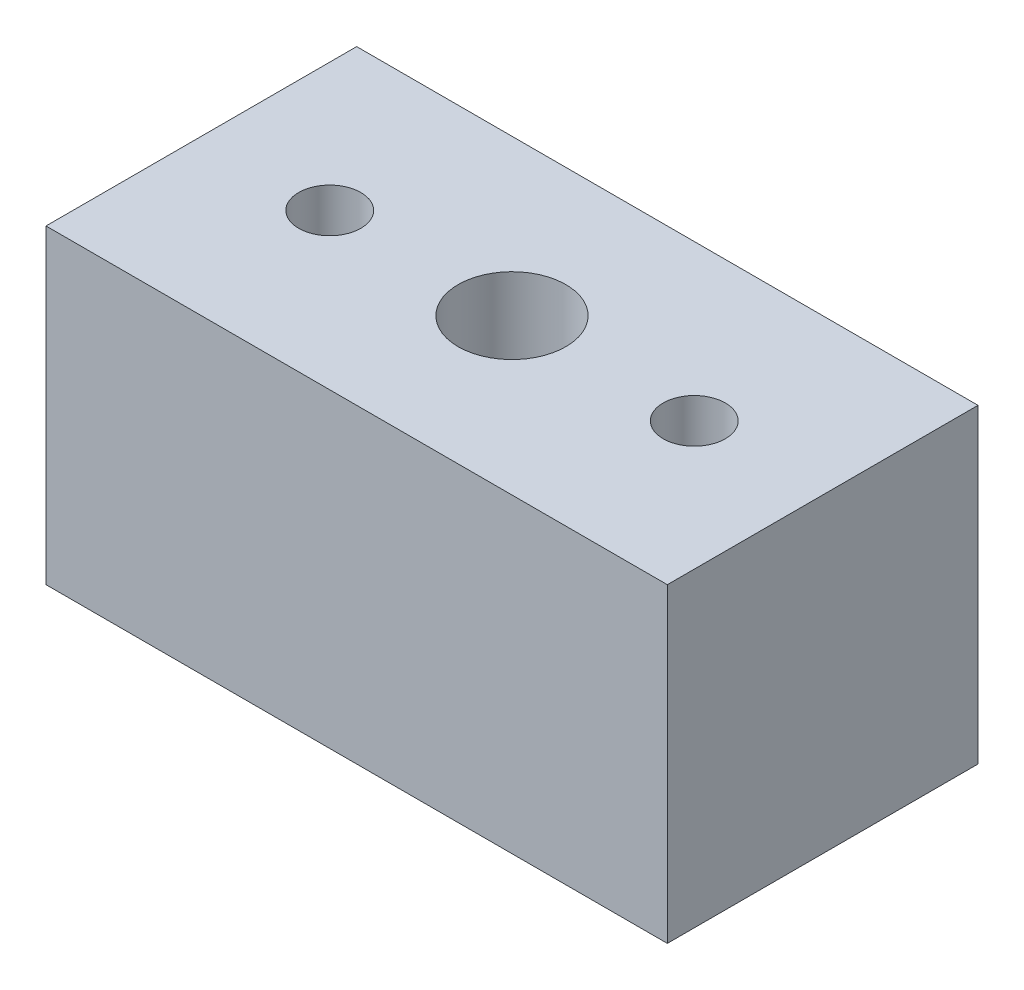
ISO-10303-21;
HEADER;
FILE_DESCRIPTION(('STEP AP214'),'2;1');
FILE_NAME('part.step','',(''),(''),'','','');
FILE_SCHEMA(('AUTOMOTIVE_DESIGN { 1 0 10303 214 1 1 1 1 }'));
ENDSEC;
DATA;
#1=APPLICATION_CONTEXT('core data for automotive mechanical design processes');
#2=APPLICATION_PROTOCOL_DEFINITION('international standard','automotive_design',2000,#1);
#3=PRODUCT_CONTEXT('',#1,'mechanical');
#4=PRODUCT('Part','Part','',(#3));
#5=PRODUCT_RELATED_PRODUCT_CATEGORY('part','',(#4));
#6=PRODUCT_DEFINITION_FORMATION('','',#4);
#7=PRODUCT_DEFINITION_CONTEXT('part definition',#1,'design');
#8=PRODUCT_DEFINITION('design','',#6,#7);
#9=PRODUCT_DEFINITION_SHAPE('','',#8);
#10=(LENGTH_UNIT() NAMED_UNIT(*) SI_UNIT(.MILLI.,.METRE.));
#11=(NAMED_UNIT(*) PLANE_ANGLE_UNIT() SI_UNIT($,.RADIAN.));
#12=(NAMED_UNIT(*) SI_UNIT($,.STERADIAN.) SOLID_ANGLE_UNIT());
#13=UNCERTAINTY_MEASURE_WITH_UNIT(LENGTH_MEASURE(1.E-05),#10,'distance_accuracy_value','');
#14=(GEOMETRIC_REPRESENTATION_CONTEXT(3) GLOBAL_UNCERTAINTY_ASSIGNED_CONTEXT((#13)) GLOBAL_UNIT_ASSIGNED_CONTEXT((#10,
#11,#12)) REPRESENTATION_CONTEXT('',''));
#15=CARTESIAN_POINT('',(0.,0.,0.));
#16=DIRECTION('',(0.,0.,1.));
#17=DIRECTION('',(1.,0.,0.));
#18=AXIS2_PLACEMENT_3D('',#15,#16,#17);
#19=CARTESIAN_POINT('',(15.,15.,7.5));
#20=DIRECTION('',(-1.,0.,0.));
#21=DIRECTION('',(0.,0.,1.));
#22=AXIS2_PLACEMENT_3D('',#19,#20,#21);
#23=PLANE('',#22);
#24=DIRECTION('',(0.,0.,-1.));
#25=VECTOR('',#24,1.);
#26=CARTESIAN_POINT('',(15.,0.,7.5));
#27=LINE('',#26,#25);
#28=CARTESIAN_POINT('',(15.,0.,7.5));
#29=VERTEX_POINT('',#28);
#30=CARTESIAN_POINT('',(15.,0.,-7.5));
#31=VERTEX_POINT('',#30);
#32=EDGE_CURVE('E97',#29,#31,#27,.T.);
#33=ORIENTED_EDGE('',*,*,#32,.T.);
#34=DIRECTION('',(0.,-1.,0.));
#35=VECTOR('',#34,1.);
#36=CARTESIAN_POINT('',(15.,15.,-7.5));
#37=LINE('',#36,#35);
#38=CARTESIAN_POINT('',(15.,15.,-7.5));
#39=VERTEX_POINT('',#38);
#40=EDGE_CURVE('E11',#39,#31,#37,.T.);
#41=ORIENTED_EDGE('',*,*,#40,.F.);
#42=DIRECTION('',(0.,0.,-1.));
#43=VECTOR('',#42,1.);
#44=CARTESIAN_POINT('',(15.,15.,7.5));
#45=LINE('',#44,#43);
#46=CARTESIAN_POINT('',(15.,15.,7.5));
#47=VERTEX_POINT('',#46);
#48=EDGE_CURVE('E85',#47,#39,#45,.T.);
#49=ORIENTED_EDGE('',*,*,#48,.F.);
#50=DIRECTION('',(0.,-1.,0.));
#51=VECTOR('',#50,1.);
#52=CARTESIAN_POINT('',(15.,15.,7.5));
#53=LINE('',#52,#51);
#54=EDGE_CURVE('E93',#47,#29,#53,.T.);
#55=ORIENTED_EDGE('',*,*,#54,.T.);
#56=EDGE_LOOP('',(#33,#41,#49,#55));
#57=FACE_BOUND('',#56,.T.);
#58=ADVANCED_FACE('F34',(#57),#23,.F.);
#59=CARTESIAN_POINT('',(-15.,15.,-7.5));
#60=DIRECTION('',(0.,0.,1.));
#61=DIRECTION('',(1.,0.,0.));
#62=AXIS2_PLACEMENT_3D('',#59,#60,#61);
#63=PLANE('',#62);
#64=DIRECTION('',(-1.,0.,0.));
#65=VECTOR('',#64,1.);
#66=CARTESIAN_POINT('',(-15.,0.,-7.5));
#67=LINE('',#66,#65);
#68=CARTESIAN_POINT('',(-15.,0.,-7.5));
#69=VERTEX_POINT('',#68);
#70=EDGE_CURVE('E89',#31,#69,#67,.T.);
#71=ORIENTED_EDGE('',*,*,#70,.T.);
#72=DIRECTION('',(0.,-1.,0.));
#73=VECTOR('',#72,1.);
#74=CARTESIAN_POINT('',(-15.,15.,-7.5));
#75=LINE('',#74,#73);
#76=CARTESIAN_POINT('',(-15.,15.,-7.5));
#77=VERTEX_POINT('',#76);
#78=EDGE_CURVE('E42',#77,#69,#75,.T.);
#79=ORIENTED_EDGE('',*,*,#78,.F.);
#80=DIRECTION('',(-1.,0.,0.));
#81=VECTOR('',#80,1.);
#82=CARTESIAN_POINT('',(-15.,15.,-7.5));
#83=LINE('',#82,#81);
#84=EDGE_CURVE('E80',#39,#77,#83,.T.);
#85=ORIENTED_EDGE('',*,*,#84,.F.);
#86=ORIENTED_EDGE('',*,*,#40,.T.);
#87=EDGE_LOOP('',(#71,#79,#85,#86));
#88=FACE_BOUND('',#87,.T.);
#89=ADVANCED_FACE('F88',(#88),#63,.F.);
#90=CARTESIAN_POINT('',(-15.,15.,7.5));
#91=DIRECTION('',(1.,0.,0.));
#92=DIRECTION('',(0.,0.,-1.));
#93=AXIS2_PLACEMENT_3D('',#90,#91,#92);
#94=PLANE('',#93);
#95=DIRECTION('',(0.,0.,1.));
#96=VECTOR('',#95,1.);
#97=CARTESIAN_POINT('',(-15.,0.,7.5));
#98=LINE('',#97,#96);
#99=CARTESIAN_POINT('',(-15.,0.,7.5));
#100=VERTEX_POINT('',#99);
#101=EDGE_CURVE('E67',#69,#100,#98,.T.);
#102=ORIENTED_EDGE('',*,*,#101,.T.);
#103=DIRECTION('',(0.,-1.,0.));
#104=VECTOR('',#103,1.);
#105=CARTESIAN_POINT('',(-15.,15.,7.5));
#106=LINE('',#105,#104);
#107=CARTESIAN_POINT('',(-15.,15.,7.5));
#108=VERTEX_POINT('',#107);
#109=EDGE_CURVE('E90',#108,#100,#106,.T.);
#110=ORIENTED_EDGE('',*,*,#109,.F.);
#111=DIRECTION('',(0.,0.,1.));
#112=VECTOR('',#111,1.);
#113=CARTESIAN_POINT('',(-15.,15.,7.5));
#114=LINE('',#113,#112);
#115=EDGE_CURVE('E83',#77,#108,#114,.T.);
#116=ORIENTED_EDGE('',*,*,#115,.F.);
#117=ORIENTED_EDGE('',*,*,#78,.T.);
#118=EDGE_LOOP('',(#102,#110,#116,#117));
#119=FACE_BOUND('',#118,.T.);
#120=ADVANCED_FACE('F91',(#119),#94,.F.);
#121=CARTESIAN_POINT('',(-15.,15.,7.5));
#122=DIRECTION('',(0.,0.,-1.));
#123=DIRECTION('',(-1.,0.,0.));
#124=AXIS2_PLACEMENT_3D('',#121,#122,#123);
#125=PLANE('',#124);
#126=DIRECTION('',(1.,0.,0.));
#127=VECTOR('',#126,1.);
#128=CARTESIAN_POINT('',(-15.,0.,7.5));
#129=LINE('',#128,#127);
#130=EDGE_CURVE('E73',#100,#29,#129,.T.);
#131=ORIENTED_EDGE('',*,*,#130,.T.);
#132=ORIENTED_EDGE('',*,*,#54,.F.);
#133=DIRECTION('',(1.,0.,0.));
#134=VECTOR('',#133,1.);
#135=CARTESIAN_POINT('',(-15.,15.,7.5));
#136=LINE('',#135,#134);
#137=EDGE_CURVE('E50',#108,#47,#136,.T.);
#138=ORIENTED_EDGE('',*,*,#137,.F.);
#139=ORIENTED_EDGE('',*,*,#109,.T.);
#140=EDGE_LOOP('',(#131,#132,#138,#139));
#141=FACE_BOUND('',#140,.T.);
#142=ADVANCED_FACE('F105',(#141),#125,.F.);
#143=CARTESIAN_POINT('',(0.,15.,0.));
#144=DIRECTION('',(0.,-1.,0.));
#145=DIRECTION('',(0.,0.,-1.));
#146=AXIS2_PLACEMENT_3D('',#143,#144,#145);
#147=PLANE('',#146);
#148=CARTESIAN_POINT('',(8.8,15.,0.));
#149=DIRECTION('',(0.,1.,0.));
#150=DIRECTION('',(0.,0.,1.));
#151=AXIS2_PLACEMENT_3D('',#148,#149,#150);
#152=CIRCLE('',#151,1.5);
#153=CARTESIAN_POINT('',(8.8,15.,1.5));
#154=VERTEX_POINT('',#153);
#155=EDGE_CURVE('E123',#154,#154,#152,.T.);
#156=ORIENTED_EDGE('',*,*,#155,.F.);
#157=EDGE_LOOP('',(#156));
#158=FACE_BOUND('',#157,.T.);
#159=CARTESIAN_POINT('',(-8.8,15.,0.));
#160=DIRECTION('',(0.,1.,0.));
#161=DIRECTION('',(0.,0.,1.));
#162=AXIS2_PLACEMENT_3D('',#159,#160,#161);
#163=CIRCLE('',#162,1.5);
#164=CARTESIAN_POINT('',(-8.8,15.,1.5));
#165=VERTEX_POINT('',#164);
#166=EDGE_CURVE('E117',#165,#165,#163,.T.);
#167=ORIENTED_EDGE('',*,*,#166,.F.);
#168=EDGE_LOOP('',(#167));
#169=FACE_BOUND('',#168,.T.);
#170=CARTESIAN_POINT('',(0.,15.,0.));
#171=DIRECTION('',(0.,1.,0.));
#172=DIRECTION('',(0.,0.,1.));
#173=AXIS2_PLACEMENT_3D('',#170,#171,#172);
#174=CIRCLE('',#173,2.6);
#175=CARTESIAN_POINT('',(0.,15.,2.6));
#176=VERTEX_POINT('',#175);
#177=EDGE_CURVE('E111',#176,#176,#174,.T.);
#178=ORIENTED_EDGE('',*,*,#177,.F.);
#179=EDGE_LOOP('',(#178));
#180=FACE_BOUND('',#179,.T.);
#181=ORIENTED_EDGE('',*,*,#48,.T.);
#182=ORIENTED_EDGE('',*,*,#84,.T.);
#183=ORIENTED_EDGE('',*,*,#115,.T.);
#184=ORIENTED_EDGE('',*,*,#137,.T.);
#185=EDGE_LOOP('',(#181,#182,#183,#184));
#186=FACE_BOUND('',#185,.T.);
#187=ADVANCED_FACE('F81',(#158,#169,#180,#186),#147,.F.);
#188=CARTESIAN_POINT('',(0.,0.,0.));
#189=DIRECTION('',(0.,-1.,0.));
#190=DIRECTION('',(0.,0.,-1.));
#191=AXIS2_PLACEMENT_3D('',#188,#189,#190);
#192=PLANE('',#191);
#193=CARTESIAN_POINT('',(8.8,0.,0.));
#194=DIRECTION('',(0.,1.,0.));
#195=DIRECTION('',(0.,0.,1.));
#196=AXIS2_PLACEMENT_3D('',#193,#194,#195);
#197=CIRCLE('',#196,1.5);
#198=CARTESIAN_POINT('',(8.8,0.,1.5));
#199=VERTEX_POINT('',#198);
#200=EDGE_CURVE('E120',#199,#199,#197,.T.);
#201=ORIENTED_EDGE('',*,*,#200,.T.);
#202=EDGE_LOOP('',(#201));
#203=FACE_BOUND('',#202,.T.);
#204=CARTESIAN_POINT('',(-8.8,0.,0.));
#205=DIRECTION('',(0.,1.,0.));
#206=DIRECTION('',(0.,0.,1.));
#207=AXIS2_PLACEMENT_3D('',#204,#205,#206);
#208=CIRCLE('',#207,1.5);
#209=CARTESIAN_POINT('',(-8.8,0.,1.5));
#210=VERTEX_POINT('',#209);
#211=EDGE_CURVE('E114',#210,#210,#208,.T.);
#212=ORIENTED_EDGE('',*,*,#211,.T.);
#213=EDGE_LOOP('',(#212));
#214=FACE_BOUND('',#213,.T.);
#215=CARTESIAN_POINT('',(0.,0.,0.));
#216=DIRECTION('',(0.,1.,0.));
#217=DIRECTION('',(0.,0.,1.));
#218=AXIS2_PLACEMENT_3D('',#215,#216,#217);
#219=CIRCLE('',#218,2.6);
#220=CARTESIAN_POINT('',(0.,0.,2.6));
#221=VERTEX_POINT('',#220);
#222=EDGE_CURVE('E100',#221,#221,#219,.T.);
#223=ORIENTED_EDGE('',*,*,#222,.T.);
#224=EDGE_LOOP('',(#223));
#225=FACE_BOUND('',#224,.T.);
#226=ORIENTED_EDGE('',*,*,#32,.F.);
#227=ORIENTED_EDGE('',*,*,#130,.F.);
#228=ORIENTED_EDGE('',*,*,#101,.F.);
#229=ORIENTED_EDGE('',*,*,#70,.F.);
#230=EDGE_LOOP('',(#226,#227,#228,#229));
#231=FACE_BOUND('',#230,.T.);
#232=ADVANCED_FACE('F108',(#203,#214,#225,#231),#192,.T.);
#233=CARTESIAN_POINT('',(0.,0.,0.));
#234=DIRECTION('',(0.,1.,0.));
#235=DIRECTION('',(0.,0.,1.));
#236=AXIS2_PLACEMENT_3D('',#233,#234,#235);
#237=CYLINDRICAL_SURFACE('',#236,2.6);
#238=ORIENTED_EDGE('',*,*,#222,.F.);
#239=EDGE_LOOP('',(#238));
#240=FACE_BOUND('',#239,.T.);
#241=ORIENTED_EDGE('',*,*,#177,.T.);
#242=EDGE_LOOP('',(#241));
#243=FACE_BOUND('',#242,.T.);
#244=ADVANCED_FACE('F145',(#240,#243),#237,.F.);
#245=CARTESIAN_POINT('',(-8.8,0.,0.));
#246=DIRECTION('',(0.,1.,0.));
#247=DIRECTION('',(0.,0.,1.));
#248=AXIS2_PLACEMENT_3D('',#245,#246,#247);
#249=CYLINDRICAL_SURFACE('',#248,1.5);
#250=ORIENTED_EDGE('',*,*,#211,.F.);
#251=EDGE_LOOP('',(#250));
#252=FACE_BOUND('',#251,.T.);
#253=ORIENTED_EDGE('',*,*,#166,.T.);
#254=EDGE_LOOP('',(#253));
#255=FACE_BOUND('',#254,.T.);
#256=ADVANCED_FACE('F134',(#252,#255),#249,.F.);
#257=CARTESIAN_POINT('',(8.8,0.,0.));
#258=DIRECTION('',(0.,1.,0.));
#259=DIRECTION('',(0.,0.,1.));
#260=AXIS2_PLACEMENT_3D('',#257,#258,#259);
#261=CYLINDRICAL_SURFACE('',#260,1.5);
#262=ORIENTED_EDGE('',*,*,#200,.F.);
#263=EDGE_LOOP('',(#262));
#264=FACE_BOUND('',#263,.T.);
#265=ORIENTED_EDGE('',*,*,#155,.T.);
#266=EDGE_LOOP('',(#265));
#267=FACE_BOUND('',#266,.T.);
#268=ADVANCED_FACE('F131',(#264,#267),#261,.F.);
#269=CLOSED_SHELL('',(#58,#89,#120,#142,#187,#232,#244,#256,#268));
#270=MANIFOLD_SOLID_BREP('B2',#269);
#271=ADVANCED_BREP_SHAPE_REPRESENTATION('',(#18,#270),#14);
#272=SHAPE_DEFINITION_REPRESENTATION(#9,#271);
ENDSEC;
END-ISO-10303-21;
